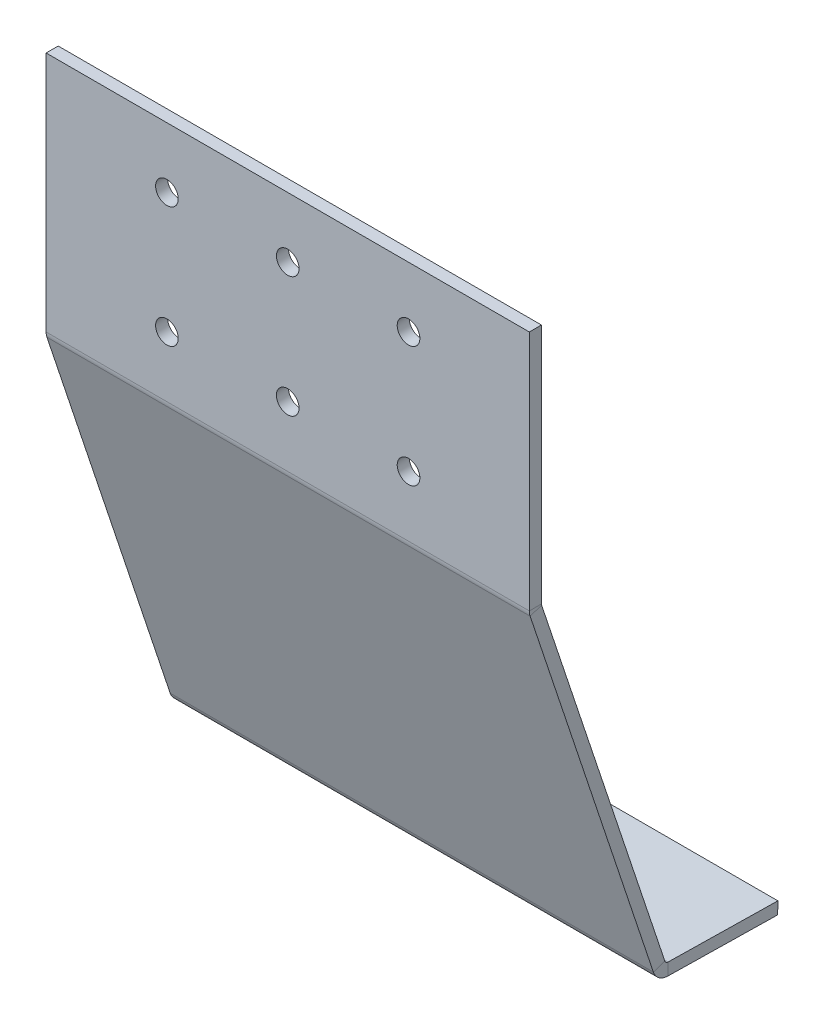
ISO-10303-21;
HEADER;
FILE_DESCRIPTION(('STEP AP214'),'2;1');
FILE_NAME('part.step','',(''),(''),'','','');
FILE_SCHEMA(('AUTOMOTIVE_DESIGN { 1 0 10303 214 1 1 1 1 }'));
ENDSEC;
DATA;
#1=APPLICATION_CONTEXT('core data for automotive mechanical design processes');
#2=APPLICATION_PROTOCOL_DEFINITION('international standard','automotive_design',2000,#1);
#3=PRODUCT_CONTEXT('',#1,'mechanical');
#4=PRODUCT('Part','Part','',(#3));
#5=PRODUCT_RELATED_PRODUCT_CATEGORY('part','',(#4));
#6=PRODUCT_DEFINITION_FORMATION('','',#4);
#7=PRODUCT_DEFINITION_CONTEXT('part definition',#1,'design');
#8=PRODUCT_DEFINITION('design','',#6,#7);
#9=PRODUCT_DEFINITION_SHAPE('','',#8);
#10=(LENGTH_UNIT() NAMED_UNIT(*) SI_UNIT(.MILLI.,.METRE.));
#11=(NAMED_UNIT(*) PLANE_ANGLE_UNIT() SI_UNIT($,.RADIAN.));
#12=(NAMED_UNIT(*) SI_UNIT($,.STERADIAN.) SOLID_ANGLE_UNIT());
#13=UNCERTAINTY_MEASURE_WITH_UNIT(LENGTH_MEASURE(1.E-05),#10,'distance_accuracy_value','');
#14=(GEOMETRIC_REPRESENTATION_CONTEXT(3) GLOBAL_UNCERTAINTY_ASSIGNED_CONTEXT((#13)) GLOBAL_UNIT_ASSIGNED_CONTEXT((#10,
#11,#12)) REPRESENTATION_CONTEXT('',''));
#15=CARTESIAN_POINT('',(0.,0.,0.));
#16=DIRECTION('',(0.,0.,1.));
#17=DIRECTION('',(1.,0.,0.));
#18=AXIS2_PLACEMENT_3D('',#15,#16,#17);
#19=CARTESIAN_POINT('',(-50.8,-107.259790632811,-27.101600760154));
#20=DIRECTION('',(1.,0.,0.));
#21=DIRECTION('',(0.,1.,0.));
#22=AXIS2_PLACEMENT_3D('',#19,#20,#21);
#23=PLANE('',#22);
#24=DIRECTION('',(0.,-0.316145823973795,0.948710608132918));
#25=VECTOR('',#24,1.);
#26=CARTESIAN_POINT('',(-50.8,-103.407012566149,-28.4950291588609));
#27=LINE('',#26,#25);
#28=CARTESIAN_POINT('',(-50.8,-103.407012566149,-28.4950291588609));
#29=VERTEX_POINT('',#28);
#30=CARTESIAN_POINT('',(-50.8,-104.210022959043,-26.0853042142033));
#31=VERTEX_POINT('',#30);
#32=EDGE_CURVE('E233',#29,#31,#27,.T.);
#33=ORIENTED_EDGE('',*,*,#32,.T.);
#34=DIRECTION('',(0.,-0.948710608132916,-0.3161458239738));
#35=VECTOR('',#34,1.);
#36=CARTESIAN_POINT('',(-50.8,-2.69937081364284,7.74183810876842));
#37=LINE('',#36,#35);
#38=CARTESIAN_POINT('',(-50.8,-26.4358834068326,-0.168054821391689));
#39=VERTEX_POINT('',#38);
#40=EDGE_CURVE('E225',#39,#31,#37,.T.);
#41=ORIENTED_EDGE('',*,*,#40,.F.);
#42=DIRECTION('',(0.,0.3161458239738,-0.948710608132916));
#43=VECTOR('',#42,1.);
#44=CARTESIAN_POINT('',(-50.8,-25.6328730139391,-2.5777797660493));
#45=LINE('',#44,#43);
#46=CARTESIAN_POINT('',(-50.8,-25.6328730139391,-2.57777976604932));
#47=VERTEX_POINT('',#46);
#48=EDGE_CURVE('E172',#47,#39,#45,.F.);
#49=ORIENTED_EDGE('',*,*,#48,.F.);
#50=DIRECTION('',(0.,0.948710608132916,0.3161458239738));
#51=VECTOR('',#50,1.);
#52=CARTESIAN_POINT('',(-50.8,-106.456780239918,-29.5113257048116));
#53=LINE('',#52,#51);
#54=EDGE_CURVE('E227',#47,#29,#53,.F.);
#55=ORIENTED_EDGE('',*,*,#54,.T.);
#56=EDGE_LOOP('',(#33,#41,#49,#55));
#57=FACE_BOUND('',#56,.T.);
#58=ADVANCED_FACE('F79',(#57),#23,.F.);
#59=CARTESIAN_POINT('',(50.8,-26.3225114686136,-0.13027505534239));
#60=DIRECTION('',(-1.,0.,0.));
#61=DIRECTION('',(0.,-1.,0.));
#62=AXIS2_PLACEMENT_3D('',#59,#60,#61);
#63=PLANE('',#62);
#64=DIRECTION('',(0.,-0.316145823973795,0.948710608132918));
#65=VECTOR('',#64,1.);
#66=CARTESIAN_POINT('',(50.8,-103.407012566149,-28.4950291588609));
#67=LINE('',#66,#65);
#68=CARTESIAN_POINT('',(50.8,-103.407012566149,-28.4950291588609));
#69=VERTEX_POINT('',#68);
#70=CARTESIAN_POINT('',(50.8,-104.210022959043,-26.0853042142033));
#71=VERTEX_POINT('',#70);
#72=EDGE_CURVE('E231',#69,#71,#67,.T.);
#73=ORIENTED_EDGE('',*,*,#72,.F.);
#74=DIRECTION('',(0.,-0.948710608132916,-0.3161458239738));
#75=VECTOR('',#74,1.);
#76=CARTESIAN_POINT('',(50.8,-25.5195010757201,-2.53999999999999));
#77=LINE('',#76,#75);
#78=CARTESIAN_POINT('',(50.8,-25.6328730139391,-2.57777976604929));
#79=VERTEX_POINT('',#78);
#80=EDGE_CURVE('E207',#69,#79,#77,.F.);
#81=ORIENTED_EDGE('',*,*,#80,.T.);
#82=DIRECTION('',(0.,0.3161458239738,-0.948710608132916));
#83=VECTOR('',#82,1.);
#84=CARTESIAN_POINT('',(50.8,-26.4358834068325,-0.168054821391686));
#85=LINE('',#84,#83);
#86=CARTESIAN_POINT('',(50.8,-26.4358834068325,-0.168054821391684));
#87=VERTEX_POINT('',#86);
#88=EDGE_CURVE('E197',#79,#87,#85,.F.);
#89=ORIENTED_EDGE('',*,*,#88,.T.);
#90=DIRECTION('',(0.,0.948710608132916,0.3161458239738));
#91=VECTOR('',#90,1.);
#92=CARTESIAN_POINT('',(50.8,-2.69937081364283,7.74183810876842));
#93=LINE('',#92,#91);
#94=EDGE_CURVE('E182',#71,#87,#93,.T.);
#95=ORIENTED_EDGE('',*,*,#94,.F.);
#96=EDGE_LOOP('',(#73,#81,#89,#95));
#97=FACE_BOUND('',#96,.T.);
#98=ADVANCED_FACE('F229',(#97),#63,.F.);
#99=CARTESIAN_POINT('',(0.,-2.69937081364283,7.74183810876842));
#100=DIRECTION('',(0.,0.3161458239738,-0.948710608132916));
#101=DIRECTION('',(0.,0.948710608132916,0.3161458239738));
#102=AXIS2_PLACEMENT_3D('',#99,#100,#101);
#103=PLANE('',#102);
#104=DIRECTION('',(-1.,0.,0.));
#105=VECTOR('',#104,1.);
#106=CARTESIAN_POINT('',(-50.8,-104.210022959043,-26.0853042142033));
#107=LINE('',#106,#105);
#108=EDGE_CURVE('E223',#31,#71,#107,.F.);
#109=ORIENTED_EDGE('',*,*,#108,.T.);
#110=ORIENTED_EDGE('',*,*,#94,.T.);
#111=DIRECTION('',(-1.,0.,0.));
#112=VECTOR('',#111,1.);
#113=CARTESIAN_POINT('',(50.8,-26.4358834068325,-0.168054821391683));
#114=LINE('',#113,#112);
#115=EDGE_CURVE('E220',#39,#87,#114,.F.);
#116=ORIENTED_EDGE('',*,*,#115,.F.);
#117=ORIENTED_EDGE('',*,*,#40,.T.);
#118=EDGE_LOOP('',(#109,#110,#116,#117));
#119=FACE_BOUND('',#118,.T.);
#120=ADVANCED_FACE('F218',(#119),#103,.F.);
#121=CARTESIAN_POINT('',(0.,-1.89636042074938,5.33211316411081));
#122=DIRECTION('',(0.,0.3161458239738,-0.948710608132916));
#123=DIRECTION('',(0.,0.948710608132916,0.3161458239738));
#124=AXIS2_PLACEMENT_3D('',#121,#122,#123);
#125=PLANE('',#124);
#126=ORIENTED_EDGE('',*,*,#80,.F.);
#127=DIRECTION('',(-1.,0.,0.));
#128=VECTOR('',#127,1.);
#129=CARTESIAN_POINT('',(-50.8,-103.407012566149,-28.4950291588609));
#130=LINE('',#129,#128);
#131=EDGE_CURVE('E96',#29,#69,#130,.F.);
#132=ORIENTED_EDGE('',*,*,#131,.F.);
#133=ORIENTED_EDGE('',*,*,#54,.F.);
#134=DIRECTION('',(-1.,0.,0.));
#135=VECTOR('',#134,1.);
#136=CARTESIAN_POINT('',(50.8,-25.6328730139391,-2.57777976604929));
#137=LINE('',#136,#135);
#138=EDGE_CURVE('E230',#79,#47,#137,.T.);
#139=ORIENTED_EDGE('',*,*,#138,.F.);
#140=EDGE_LOOP('',(#126,#132,#133,#139));
#141=FACE_BOUND('',#140,.T.);
#142=ADVANCED_FACE('F581',(#141),#125,.T.);
#143=CARTESIAN_POINT('',(-50.8,-25.4,-2.54));
#144=DIRECTION('',(-1.,0.,0.));
#145=DIRECTION('',(0.,0.,1.));
#146=AXIS2_PLACEMENT_3D('',#143,#144,#145);
#147=PLANE('',#146);
#148=DIRECTION('',(0.,-1.,0.));
#149=VECTOR('',#148,1.);
#150=CARTESIAN_POINT('',(-50.8,-25.4,0.));
#151=LINE('',#150,#149);
#152=CARTESIAN_POINT('',(-50.8,25.4,0.));
#153=VERTEX_POINT('',#152);
#154=CARTESIAN_POINT('',(-50.8,-25.4,0.));
#155=VERTEX_POINT('',#154);
#156=EDGE_CURVE('E126',#153,#155,#151,.T.);
#157=ORIENTED_EDGE('',*,*,#156,.F.);
#158=DIRECTION('',(0.,0.,1.));
#159=VECTOR('',#158,1.);
#160=CARTESIAN_POINT('',(-50.8,25.4,-2.54));
#161=LINE('',#160,#159);
#162=CARTESIAN_POINT('',(-50.8,25.4,-2.54));
#163=VERTEX_POINT('',#162);
#164=EDGE_CURVE('E13',#163,#153,#161,.T.);
#165=ORIENTED_EDGE('',*,*,#164,.F.);
#166=DIRECTION('',(0.,-1.,0.));
#167=VECTOR('',#166,1.);
#168=CARTESIAN_POINT('',(-50.8,-25.4,-2.54));
#169=LINE('',#168,#167);
#170=CARTESIAN_POINT('',(-50.8,-25.4,-2.54000000000003));
#171=VERTEX_POINT('',#170);
#172=EDGE_CURVE('E137',#163,#171,#169,.T.);
#173=ORIENTED_EDGE('',*,*,#172,.T.);
#174=DIRECTION('',(0.,0.,1.));
#175=VECTOR('',#174,1.);
#176=CARTESIAN_POINT('',(-50.8,-25.4,-2.54));
#177=LINE('',#176,#175);
#178=EDGE_CURVE('E83',#171,#155,#177,.T.);
#179=ORIENTED_EDGE('',*,*,#178,.T.);
#180=EDGE_LOOP('',(#157,#165,#173,#179));
#181=FACE_BOUND('',#180,.T.);
#182=ADVANCED_FACE('F81',(#181),#147,.T.);
#183=CARTESIAN_POINT('',(50.8,25.4,-2.54));
#184=DIRECTION('',(0.,1.,0.));
#185=DIRECTION('',(-1.,0.,0.));
#186=AXIS2_PLACEMENT_3D('',#183,#184,#185);
#187=PLANE('',#186);
#188=DIRECTION('',(-1.,0.,0.));
#189=VECTOR('',#188,1.);
#190=CARTESIAN_POINT('',(50.8,25.4,0.));
#191=LINE('',#190,#189);
#192=CARTESIAN_POINT('',(50.8,25.4,0.));
#193=VERTEX_POINT('',#192);
#194=EDGE_CURVE('E121',#193,#153,#191,.T.);
#195=ORIENTED_EDGE('',*,*,#194,.F.);
#196=DIRECTION('',(0.,0.,1.));
#197=VECTOR('',#196,1.);
#198=CARTESIAN_POINT('',(50.8,25.4,-2.54));
#199=LINE('',#198,#197);
#200=CARTESIAN_POINT('',(50.8,25.4,-2.54));
#201=VERTEX_POINT('',#200);
#202=EDGE_CURVE('E88',#201,#193,#199,.T.);
#203=ORIENTED_EDGE('',*,*,#202,.F.);
#204=DIRECTION('',(-1.,0.,0.));
#205=VECTOR('',#204,1.);
#206=CARTESIAN_POINT('',(50.8,25.4,-2.54));
#207=LINE('',#206,#205);
#208=EDGE_CURVE('E123',#201,#163,#207,.T.);
#209=ORIENTED_EDGE('',*,*,#208,.T.);
#210=ORIENTED_EDGE('',*,*,#164,.T.);
#211=EDGE_LOOP('',(#195,#203,#209,#210));
#212=FACE_BOUND('',#211,.T.);
#213=ADVANCED_FACE('F119',(#212),#187,.T.);
#214=CARTESIAN_POINT('',(50.8,-25.4,-2.54));
#215=DIRECTION('',(1.,0.,0.));
#216=DIRECTION('',(0.,0.,-1.));
#217=AXIS2_PLACEMENT_3D('',#214,#215,#216);
#218=PLANE('',#217);
#219=DIRECTION('',(0.,1.,0.));
#220=VECTOR('',#219,1.);
#221=CARTESIAN_POINT('',(50.8,-25.4,0.));
#222=LINE('',#221,#220);
#223=CARTESIAN_POINT('',(50.8,-25.4,0.));
#224=VERTEX_POINT('',#223);
#225=EDGE_CURVE('E136',#224,#193,#222,.T.);
#226=ORIENTED_EDGE('',*,*,#225,.F.);
#227=DIRECTION('',(0.,0.,1.));
#228=VECTOR('',#227,1.);
#229=CARTESIAN_POINT('',(50.8,-25.4,-2.54));
#230=LINE('',#229,#228);
#231=CARTESIAN_POINT('',(50.8,-25.4,-2.54));
#232=VERTEX_POINT('',#231);
#233=EDGE_CURVE('E144',#232,#224,#230,.T.);
#234=ORIENTED_EDGE('',*,*,#233,.F.);
#235=DIRECTION('',(0.,1.,0.));
#236=VECTOR('',#235,1.);
#237=CARTESIAN_POINT('',(50.8,-25.4,-2.54));
#238=LINE('',#237,#236);
#239=EDGE_CURVE('E150',#232,#201,#238,.T.);
#240=ORIENTED_EDGE('',*,*,#239,.T.);
#241=ORIENTED_EDGE('',*,*,#202,.T.);
#242=EDGE_LOOP('',(#226,#234,#240,#241));
#243=FACE_BOUND('',#242,.T.);
#244=ADVANCED_FACE('F199',(#243),#218,.T.);
#245=CARTESIAN_POINT('',(0.,0.,-2.54));
#246=DIRECTION('',(0.,0.,1.));
#247=DIRECTION('',(1.,0.,0.));
#248=AXIS2_PLACEMENT_3D('',#245,#246,#247);
#249=PLANE('',#248);
#250=CARTESIAN_POINT('',(-25.4,-12.7,-2.54));
#251=DIRECTION('',(0.,0.,1.));
#252=DIRECTION('',(1.,0.,0.));
#253=AXIS2_PLACEMENT_3D('',#250,#251,#252);
#254=CIRCLE('',#253,2.38125);
#255=CARTESIAN_POINT('',(-23.01875,-12.7,-2.54));
#256=VERTEX_POINT('',#255);
#257=EDGE_CURVE('E322',#256,#256,#254,.T.);
#258=ORIENTED_EDGE('',*,*,#257,.T.);
#259=EDGE_LOOP('',(#258));
#260=FACE_BOUND('',#259,.T.);
#261=CARTESIAN_POINT('',(0.,-12.7,-2.54));
#262=DIRECTION('',(0.,0.,1.));
#263=DIRECTION('',(1.,0.,0.));
#264=AXIS2_PLACEMENT_3D('',#261,#262,#263);
#265=CIRCLE('',#264,2.38125);
#266=CARTESIAN_POINT('',(2.38125,-12.7,-2.54));
#267=VERTEX_POINT('',#266);
#268=EDGE_CURVE('E316',#267,#267,#265,.T.);
#269=ORIENTED_EDGE('',*,*,#268,.T.);
#270=EDGE_LOOP('',(#269));
#271=FACE_BOUND('',#270,.T.);
#272=CARTESIAN_POINT('',(25.4,-12.7,-2.54));
#273=DIRECTION('',(0.,0.,1.));
#274=DIRECTION('',(1.,0.,0.));
#275=AXIS2_PLACEMENT_3D('',#272,#273,#274);
#276=CIRCLE('',#275,2.38125);
#277=CARTESIAN_POINT('',(27.78125,-12.7,-2.54));
#278=VERTEX_POINT('',#277);
#279=EDGE_CURVE('E310',#278,#278,#276,.T.);
#280=ORIENTED_EDGE('',*,*,#279,.T.);
#281=EDGE_LOOP('',(#280));
#282=FACE_BOUND('',#281,.T.);
#283=CARTESIAN_POINT('',(25.4,12.7,-2.54));
#284=DIRECTION('',(0.,0.,1.));
#285=DIRECTION('',(1.,0.,0.));
#286=AXIS2_PLACEMENT_3D('',#283,#284,#285);
#287=CIRCLE('',#286,2.38125);
#288=CARTESIAN_POINT('',(27.78125,12.7,-2.54));
#289=VERTEX_POINT('',#288);
#290=EDGE_CURVE('E304',#289,#289,#287,.T.);
#291=ORIENTED_EDGE('',*,*,#290,.T.);
#292=EDGE_LOOP('',(#291));
#293=FACE_BOUND('',#292,.T.);
#294=CARTESIAN_POINT('',(0.,12.7,-2.54));
#295=DIRECTION('',(0.,0.,1.));
#296=DIRECTION('',(1.,0.,0.));
#297=AXIS2_PLACEMENT_3D('',#294,#295,#296);
#298=CIRCLE('',#297,2.38125);
#299=CARTESIAN_POINT('',(2.38125,12.7,-2.54));
#300=VERTEX_POINT('',#299);
#301=EDGE_CURVE('E298',#300,#300,#298,.T.);
#302=ORIENTED_EDGE('',*,*,#301,.T.);
#303=EDGE_LOOP('',(#302));
#304=FACE_BOUND('',#303,.T.);
#305=CARTESIAN_POINT('',(-25.4,12.7,-2.54));
#306=DIRECTION('',(0.,0.,1.));
#307=DIRECTION('',(1.,0.,0.));
#308=AXIS2_PLACEMENT_3D('',#305,#306,#307);
#309=CIRCLE('',#308,2.38125);
#310=CARTESIAN_POINT('',(-23.01875,12.7,-2.54));
#311=VERTEX_POINT('',#310);
#312=EDGE_CURVE('E261',#311,#311,#309,.T.);
#313=ORIENTED_EDGE('',*,*,#312,.T.);
#314=EDGE_LOOP('',(#313));
#315=FACE_BOUND('',#314,.T.);
#316=ORIENTED_EDGE('',*,*,#172,.F.);
#317=ORIENTED_EDGE('',*,*,#208,.F.);
#318=ORIENTED_EDGE('',*,*,#239,.F.);
#319=DIRECTION('',(1.,0.,0.));
#320=VECTOR('',#319,1.);
#321=CARTESIAN_POINT('',(50.8,-25.4,-2.54));
#322=LINE('',#321,#320);
#323=EDGE_CURVE('E139',#171,#232,#322,.T.);
#324=ORIENTED_EDGE('',*,*,#323,.F.);
#325=EDGE_LOOP('',(#316,#317,#318,#324));
#326=FACE_BOUND('',#325,.T.);
#327=ADVANCED_FACE('F200',(#260,#271,#282,#293,#304,#315,#326),#249,.F.);
#328=CARTESIAN_POINT('',(0.,0.,0.));
#329=DIRECTION('',(0.,0.,1.));
#330=DIRECTION('',(1.,0.,0.));
#331=AXIS2_PLACEMENT_3D('',#328,#329,#330);
#332=PLANE('',#331);
#333=CARTESIAN_POINT('',(-25.4,-12.7,0.));
#334=DIRECTION('',(0.,0.,1.));
#335=DIRECTION('',(-1.,0.,0.));
#336=AXIS2_PLACEMENT_3D('',#333,#334,#335);
#337=CIRCLE('',#336,2.38125);
#338=CARTESIAN_POINT('',(-27.78125,-12.7,0.));
#339=VERTEX_POINT('',#338);
#340=EDGE_CURVE('E325',#339,#339,#337,.T.);
#341=ORIENTED_EDGE('',*,*,#340,.F.);
#342=EDGE_LOOP('',(#341));
#343=FACE_BOUND('',#342,.T.);
#344=CARTESIAN_POINT('',(0.,-12.7,0.));
#345=DIRECTION('',(0.,0.,1.));
#346=DIRECTION('',(-1.,0.,0.));
#347=AXIS2_PLACEMENT_3D('',#344,#345,#346);
#348=CIRCLE('',#347,2.38125);
#349=CARTESIAN_POINT('',(-2.38125,-12.7,0.));
#350=VERTEX_POINT('',#349);
#351=EDGE_CURVE('E319',#350,#350,#348,.T.);
#352=ORIENTED_EDGE('',*,*,#351,.F.);
#353=EDGE_LOOP('',(#352));
#354=FACE_BOUND('',#353,.T.);
#355=CARTESIAN_POINT('',(25.4,-12.7,0.));
#356=DIRECTION('',(0.,0.,1.));
#357=DIRECTION('',(-1.,0.,0.));
#358=AXIS2_PLACEMENT_3D('',#355,#356,#357);
#359=CIRCLE('',#358,2.38125);
#360=CARTESIAN_POINT('',(23.01875,-12.7,0.));
#361=VERTEX_POINT('',#360);
#362=EDGE_CURVE('E313',#361,#361,#359,.T.);
#363=ORIENTED_EDGE('',*,*,#362,.F.);
#364=EDGE_LOOP('',(#363));
#365=FACE_BOUND('',#364,.T.);
#366=CARTESIAN_POINT('',(25.4,12.7,0.));
#367=DIRECTION('',(0.,0.,1.));
#368=DIRECTION('',(1.,0.,0.));
#369=AXIS2_PLACEMENT_3D('',#366,#367,#368);
#370=CIRCLE('',#369,2.38125);
#371=CARTESIAN_POINT('',(27.78125,12.7,0.));
#372=VERTEX_POINT('',#371);
#373=EDGE_CURVE('E307',#372,#372,#370,.T.);
#374=ORIENTED_EDGE('',*,*,#373,.F.);
#375=EDGE_LOOP('',(#374));
#376=FACE_BOUND('',#375,.T.);
#377=CARTESIAN_POINT('',(0.,12.7,0.));
#378=DIRECTION('',(0.,0.,1.));
#379=DIRECTION('',(1.,0.,0.));
#380=AXIS2_PLACEMENT_3D('',#377,#378,#379);
#381=CIRCLE('',#380,2.38125);
#382=CARTESIAN_POINT('',(2.38125,12.7,0.));
#383=VERTEX_POINT('',#382);
#384=EDGE_CURVE('E301',#383,#383,#381,.T.);
#385=ORIENTED_EDGE('',*,*,#384,.F.);
#386=EDGE_LOOP('',(#385));
#387=FACE_BOUND('',#386,.T.);
#388=CARTESIAN_POINT('',(-25.4,12.7,0.));
#389=DIRECTION('',(0.,0.,1.));
#390=DIRECTION('',(1.,0.,0.));
#391=AXIS2_PLACEMENT_3D('',#388,#389,#390);
#392=CIRCLE('',#391,2.38125);
#393=CARTESIAN_POINT('',(-23.01875,12.7,0.));
#394=VERTEX_POINT('',#393);
#395=EDGE_CURVE('E295',#394,#394,#392,.T.);
#396=ORIENTED_EDGE('',*,*,#395,.F.);
#397=EDGE_LOOP('',(#396));
#398=FACE_BOUND('',#397,.T.);
#399=ORIENTED_EDGE('',*,*,#156,.T.);
#400=DIRECTION('',(1.,0.,0.));
#401=VECTOR('',#400,1.);
#402=CARTESIAN_POINT('',(50.8,-25.4,0.));
#403=LINE('',#402,#401);
#404=EDGE_CURVE('E130',#155,#224,#403,.T.);
#405=ORIENTED_EDGE('',*,*,#404,.T.);
#406=ORIENTED_EDGE('',*,*,#225,.T.);
#407=ORIENTED_EDGE('',*,*,#194,.T.);
#408=EDGE_LOOP('',(#399,#405,#406,#407));
#409=FACE_BOUND('',#408,.T.);
#410=ADVANCED_FACE('F134',(#343,#354,#365,#376,#387,#398,#409),#332,.T.);
#411=CARTESIAN_POINT('',(50.8,-25.4,-3.2766));
#412=DIRECTION('',(1.,0.,0.));
#413=DIRECTION('',(0.,0.,-1.));
#414=AXIS2_PLACEMENT_3D('',#411,#412,#413);
#415=PLANE('',#414);
#416=ORIENTED_EDGE('',*,*,#88,.F.);
#417=CARTESIAN_POINT('',(50.8,-25.4,-3.2766));
#418=DIRECTION('',(-1.,0.,0.));
#419=DIRECTION('',(0.,0.,1.));
#420=AXIS2_PLACEMENT_3D('',#417,#418,#419);
#421=CIRCLE('',#420,0.736600000000006);
#422=EDGE_CURVE('E174',#232,#79,#421,.F.);
#423=ORIENTED_EDGE('',*,*,#422,.F.);
#424=ORIENTED_EDGE('',*,*,#233,.T.);
#425=CARTESIAN_POINT('',(50.8,-25.4,-3.2766));
#426=DIRECTION('',(-1.,0.,0.));
#427=DIRECTION('',(0.,0.,1.));
#428=AXIS2_PLACEMENT_3D('',#425,#426,#427);
#429=CIRCLE('',#428,3.27660000000001);
#430=EDGE_CURVE('E131',#224,#87,#429,.F.);
#431=ORIENTED_EDGE('',*,*,#430,.T.);
#432=EDGE_LOOP('',(#416,#423,#424,#431));
#433=FACE_BOUND('',#432,.T.);
#434=ADVANCED_FACE('F195',(#433),#415,.T.);
#435=CARTESIAN_POINT('',(-50.8,-25.4,-3.27660000000003));
#436=DIRECTION('',(1.,0.,0.));
#437=DIRECTION('',(0.,0.,-1.));
#438=AXIS2_PLACEMENT_3D('',#435,#436,#437);
#439=PLANE('',#438);
#440=CARTESIAN_POINT('',(-50.8,-25.4,-3.27660000000003));
#441=DIRECTION('',(-1.,0.,0.));
#442=DIRECTION('',(0.,0.,1.));
#443=AXIS2_PLACEMENT_3D('',#440,#441,#442);
#444=CIRCLE('',#443,0.736600000000006);
#445=EDGE_CURVE('E178',#47,#171,#444,.T.);
#446=ORIENTED_EDGE('',*,*,#445,.F.);
#447=ORIENTED_EDGE('',*,*,#48,.T.);
#448=CARTESIAN_POINT('',(-50.8,-25.4,-3.27660000000003));
#449=DIRECTION('',(-1.,0.,0.));
#450=DIRECTION('',(0.,0.,1.));
#451=AXIS2_PLACEMENT_3D('',#448,#449,#450);
#452=CIRCLE('',#451,3.27660000000001);
#453=EDGE_CURVE('E162',#39,#155,#452,.T.);
#454=ORIENTED_EDGE('',*,*,#453,.T.);
#455=ORIENTED_EDGE('',*,*,#178,.F.);
#456=EDGE_LOOP('',(#446,#447,#454,#455));
#457=FACE_BOUND('',#456,.T.);
#458=ADVANCED_FACE('F168',(#457),#439,.F.);
#459=CARTESIAN_POINT('',(-50.8,-25.4,-3.27660000000003));
#460=DIRECTION('',(-1.,0.,0.));
#461=DIRECTION('',(0.,-0.3161458239738,0.948710608132916));
#462=AXIS2_PLACEMENT_3D('',#459,#460,#461);
#463=CYLINDRICAL_SURFACE('',#462,3.27660000000001);
#464=ORIENTED_EDGE('',*,*,#404,.F.);
#465=ORIENTED_EDGE('',*,*,#453,.F.);
#466=ORIENTED_EDGE('',*,*,#115,.T.);
#467=ORIENTED_EDGE('',*,*,#430,.F.);
#468=EDGE_LOOP('',(#464,#465,#466,#467));
#469=FACE_BOUND('',#468,.T.);
#470=ADVANCED_FACE('F159',(#469),#463,.T.);
#471=CARTESIAN_POINT('',(-50.8,-25.4,-3.27660000000003));
#472=DIRECTION('',(-1.,0.,0.));
#473=DIRECTION('',(0.,-0.3161458239738,0.948710608132916));
#474=AXIS2_PLACEMENT_3D('',#471,#472,#473);
#475=CYLINDRICAL_SURFACE('',#474,0.736600000000006);
#476=ORIENTED_EDGE('',*,*,#323,.T.);
#477=ORIENTED_EDGE('',*,*,#422,.T.);
#478=ORIENTED_EDGE('',*,*,#138,.T.);
#479=ORIENTED_EDGE('',*,*,#445,.T.);
#480=EDGE_LOOP('',(#476,#477,#478,#479));
#481=FACE_BOUND('',#480,.T.);
#482=ADVANCED_FACE('F187',(#481),#475,.F.);
#483=CARTESIAN_POINT('',(50.8,-103.17413955221,-29.1938493928116));
#484=DIRECTION('',(1.,0.,0.));
#485=DIRECTION('',(0.,0.,-1.));
#486=AXIS2_PLACEMENT_3D('',#483,#484,#485);
#487=PLANE('',#486);
#488=DIRECTION('',(0.,-0.999847695156391,0.017452406437294));
#489=VECTOR('',#488,1.);
#490=CARTESIAN_POINT('',(50.8,-106.450240510159,-29.1366648378792));
#491=LINE('',#490,#489);
#492=CARTESIAN_POINT('',(50.8,-103.910627364462,-29.1809939502299));
#493=VERTEX_POINT('',#492);
#494=CARTESIAN_POINT('',(50.8,-106.450240510159,-29.1366648378792));
#495=VERTEX_POINT('',#494);
#496=EDGE_CURVE('E257',#493,#495,#491,.T.);
#497=ORIENTED_EDGE('',*,*,#496,.F.);
#498=CARTESIAN_POINT('',(50.8,-103.17413955221,-29.1938493928116));
#499=DIRECTION('',(-1.,0.,0.));
#500=DIRECTION('',(0.,0.,1.));
#501=AXIS2_PLACEMENT_3D('',#498,#499,#500);
#502=CIRCLE('',#501,0.736599999999992);
#503=EDGE_CURVE('E248',#69,#493,#502,.F.);
#504=ORIENTED_EDGE('',*,*,#503,.F.);
#505=ORIENTED_EDGE('',*,*,#72,.T.);
#506=CARTESIAN_POINT('',(50.8,-103.17413955221,-29.1938493928116));
#507=DIRECTION('',(-1.,0.,0.));
#508=DIRECTION('',(0.,0.,1.));
#509=AXIS2_PLACEMENT_3D('',#506,#507,#508);
#510=CIRCLE('',#509,3.27659999999999);
#511=EDGE_CURVE('E241',#71,#495,#510,.F.);
#512=ORIENTED_EDGE('',*,*,#511,.T.);
#513=EDGE_LOOP('',(#497,#504,#505,#512));
#514=FACE_BOUND('',#513,.T.);
#515=ADVANCED_FACE('F375',(#514),#487,.T.);
#516=CARTESIAN_POINT('',(-50.8,-103.17413955221,-29.1938493928116));
#517=DIRECTION('',(1.,0.,0.));
#518=DIRECTION('',(0.,0.,-1.));
#519=AXIS2_PLACEMENT_3D('',#516,#517,#518);
#520=PLANE('',#519);
#521=CARTESIAN_POINT('',(-50.8,-103.17413955221,-29.1938493928116));
#522=DIRECTION('',(-1.,0.,0.));
#523=DIRECTION('',(0.,0.,1.));
#524=AXIS2_PLACEMENT_3D('',#521,#522,#523);
#525=CIRCLE('',#524,0.736599999999992);
#526=CARTESIAN_POINT('',(-50.8,-103.910627364462,-29.1809939502299));
#527=VERTEX_POINT('',#526);
#528=EDGE_CURVE('E243',#527,#29,#525,.T.);
#529=ORIENTED_EDGE('',*,*,#528,.F.);
#530=DIRECTION('',(0.,-0.999847695156391,0.017452406437294));
#531=VECTOR('',#530,1.);
#532=CARTESIAN_POINT('',(-50.8,-103.910627364462,-29.1809939502299));
#533=LINE('',#532,#531);
#534=CARTESIAN_POINT('',(-50.8,-106.450240510159,-29.1366648378792));
#535=VERTEX_POINT('',#534);
#536=EDGE_CURVE('E264',#527,#535,#533,.T.);
#537=ORIENTED_EDGE('',*,*,#536,.T.);
#538=CARTESIAN_POINT('',(-50.8,-103.17413955221,-29.1938493928116));
#539=DIRECTION('',(-1.,0.,0.));
#540=DIRECTION('',(0.,0.,1.));
#541=AXIS2_PLACEMENT_3D('',#538,#539,#540);
#542=CIRCLE('',#541,3.27659999999999);
#543=EDGE_CURVE('E251',#535,#31,#542,.T.);
#544=ORIENTED_EDGE('',*,*,#543,.T.);
#545=ORIENTED_EDGE('',*,*,#32,.F.);
#546=EDGE_LOOP('',(#529,#537,#544,#545));
#547=FACE_BOUND('',#546,.T.);
#548=ADVANCED_FACE('F397',(#547),#520,.F.);
#549=CARTESIAN_POINT('',(-50.8,-103.17413955221,-29.1938493928116));
#550=DIRECTION('',(-1.,0.,0.));
#551=DIRECTION('',(0.,-0.999847695156391,0.0174524064372941));
#552=AXIS2_PLACEMENT_3D('',#549,#550,#551);
#553=CYLINDRICAL_SURFACE('',#552,3.27659999999999);
#554=ORIENTED_EDGE('',*,*,#108,.F.);
#555=ORIENTED_EDGE('',*,*,#543,.F.);
#556=DIRECTION('',(-1.,0.,0.));
#557=VECTOR('',#556,1.);
#558=CARTESIAN_POINT('',(0.,-106.450240510159,-29.1366648378792));
#559=LINE('',#558,#557);
#560=EDGE_CURVE('E267',#495,#535,#559,.T.);
#561=ORIENTED_EDGE('',*,*,#560,.F.);
#562=ORIENTED_EDGE('',*,*,#511,.F.);
#563=EDGE_LOOP('',(#554,#555,#561,#562));
#564=FACE_BOUND('',#563,.T.);
#565=ADVANCED_FACE('F406',(#564),#553,.T.);
#566=CARTESIAN_POINT('',(-50.8,-103.17413955221,-29.1938493928116));
#567=DIRECTION('',(-1.,0.,0.));
#568=DIRECTION('',(0.,-0.999847695156391,0.0174524064372941));
#569=AXIS2_PLACEMENT_3D('',#566,#567,#568);
#570=CYLINDRICAL_SURFACE('',#569,0.736599999999992);
#571=ORIENTED_EDGE('',*,*,#131,.T.);
#572=ORIENTED_EDGE('',*,*,#503,.T.);
#573=DIRECTION('',(1.,0.,0.));
#574=VECTOR('',#573,1.);
#575=CARTESIAN_POINT('',(50.8,-103.910627364462,-29.1809939502299));
#576=LINE('',#575,#574);
#577=EDGE_CURVE('E260',#493,#527,#576,.F.);
#578=ORIENTED_EDGE('',*,*,#577,.T.);
#579=ORIENTED_EDGE('',*,*,#528,.T.);
#580=EDGE_LOOP('',(#571,#572,#578,#579));
#581=FACE_BOUND('',#580,.T.);
#582=ADVANCED_FACE('F414',(#581),#570,.F.);
#583=CARTESIAN_POINT('',(-50.8,-106.441143401271,-28.6154918186822));
#584=DIRECTION('',(-1.,0.,0.));
#585=DIRECTION('',(0.,0.,1.));
#586=AXIS2_PLACEMENT_3D('',#583,#584,#585);
#587=PLANE('',#586);
#588=DIRECTION('',(0.,0.0174524064372941,0.999847695156391));
#589=VECTOR('',#588,1.);
#590=CARTESIAN_POINT('',(-50.8,-106.441143401271,-28.6154918186822));
#591=LINE('',#590,#589);
#592=CARTESIAN_POINT('',(-50.7999999999999,-106.853065183782,-52.214474933596));
#593=VERTEX_POINT('',#592);
#594=EDGE_CURVE('E285',#593,#535,#591,.T.);
#595=ORIENTED_EDGE('',*,*,#594,.T.);
#596=ORIENTED_EDGE('',*,*,#536,.F.);
#597=DIRECTION('',(0.,-0.0174524064372941,-0.999847695156391));
#598=VECTOR('',#597,1.);
#599=CARTESIAN_POINT('',(-50.8,-103.354139751434,2.70016004812564));
#600=LINE('',#599,#598);
#601=CARTESIAN_POINT('',(-50.7999999999999,-104.313452038084,-52.2588040459468));
#602=VERTEX_POINT('',#601);
#603=EDGE_CURVE('E276',#602,#527,#600,.F.);
#604=ORIENTED_EDGE('',*,*,#603,.F.);
#605=DIRECTION('',(0.,0.999847695156391,-0.017452406437294));
#606=VECTOR('',#605,1.);
#607=CARTESIAN_POINT('',(-50.7999999999999,-106.853065183782,-52.214474933596));
#608=LINE('',#607,#606);
#609=EDGE_CURVE('E246',#593,#602,#608,.T.);
#610=ORIENTED_EDGE('',*,*,#609,.F.);
#611=EDGE_LOOP('',(#595,#596,#604,#610));
#612=FACE_BOUND('',#611,.T.);
#613=ADVANCED_FACE('F422',(#612),#587,.T.);
#614=CARTESIAN_POINT('',(50.8,-106.853065183782,-52.214474933596));
#615=DIRECTION('',(1.,0.,0.));
#616=DIRECTION('',(0.,0.,-1.));
#617=AXIS2_PLACEMENT_3D('',#614,#615,#616);
#618=PLANE('',#617);
#619=DIRECTION('',(0.,0.0174524064372941,0.999847695156391));
#620=VECTOR('',#619,1.);
#621=CARTESIAN_POINT('',(50.8,-103.354139751434,2.70016004812579));
#622=LINE('',#621,#620);
#623=CARTESIAN_POINT('',(50.8,-104.313452038084,-52.2588040459468));
#624=VERTEX_POINT('',#623);
#625=EDGE_CURVE('E270',#493,#624,#622,.F.);
#626=ORIENTED_EDGE('',*,*,#625,.F.);
#627=ORIENTED_EDGE('',*,*,#496,.T.);
#628=DIRECTION('',(0.,-0.0174524064372941,-0.999847695156391));
#629=VECTOR('',#628,1.);
#630=CARTESIAN_POINT('',(50.8,-106.853065183782,-52.214474933596));
#631=LINE('',#630,#629);
#632=CARTESIAN_POINT('',(50.8,-106.853065183782,-52.214474933596));
#633=VERTEX_POINT('',#632);
#634=EDGE_CURVE('E279',#495,#633,#631,.T.);
#635=ORIENTED_EDGE('',*,*,#634,.T.);
#636=DIRECTION('',(0.,0.999847695156391,-0.017452406437294));
#637=VECTOR('',#636,1.);
#638=CARTESIAN_POINT('',(50.8,-106.853065183782,-52.214474933596));
#639=LINE('',#638,#637);
#640=EDGE_CURVE('E288',#633,#624,#639,.T.);
#641=ORIENTED_EDGE('',*,*,#640,.T.);
#642=EDGE_LOOP('',(#626,#627,#635,#641));
#643=FACE_BOUND('',#642,.T.);
#644=ADVANCED_FACE('F430',(#643),#618,.T.);
#645=CARTESIAN_POINT('',(0.,-105.893752897131,2.74448916047644));
#646=DIRECTION('',(0.,-0.999847695156391,0.0174524064372941));
#647=DIRECTION('',(0.,-0.0174524064372941,-0.999847695156391));
#648=AXIS2_PLACEMENT_3D('',#645,#646,#647);
#649=PLANE('',#648);
#650=ORIENTED_EDGE('',*,*,#634,.F.);
#651=ORIENTED_EDGE('',*,*,#560,.T.);
#652=ORIENTED_EDGE('',*,*,#594,.F.);
#653=DIRECTION('',(-1.,0.,0.));
#654=VECTOR('',#653,1.);
#655=CARTESIAN_POINT('',(-50.7999999999999,-106.853065183782,-52.214474933596));
#656=LINE('',#655,#654);
#657=EDGE_CURVE('E282',#633,#593,#656,.T.);
#658=ORIENTED_EDGE('',*,*,#657,.F.);
#659=EDGE_LOOP('',(#650,#651,#652,#658));
#660=FACE_BOUND('',#659,.T.);
#661=ADVANCED_FACE('F438',(#660),#649,.T.);
#662=CARTESIAN_POINT('',(0.,-103.354139751434,2.70016004812571));
#663=DIRECTION('',(0.,-0.999847695156391,0.0174524064372941));
#664=DIRECTION('',(0.,-0.0174524064372941,-0.999847695156391));
#665=AXIS2_PLACEMENT_3D('',#662,#663,#664);
#666=PLANE('',#665);
#667=ORIENTED_EDGE('',*,*,#577,.F.);
#668=ORIENTED_EDGE('',*,*,#625,.T.);
#669=DIRECTION('',(1.,0.,0.));
#670=VECTOR('',#669,1.);
#671=CARTESIAN_POINT('',(0.,-104.313452038084,-52.2588040459468));
#672=LINE('',#671,#670);
#673=EDGE_CURVE('E273',#624,#602,#672,.F.);
#674=ORIENTED_EDGE('',*,*,#673,.T.);
#675=ORIENTED_EDGE('',*,*,#603,.T.);
#676=EDGE_LOOP('',(#667,#668,#674,#675));
#677=FACE_BOUND('',#676,.T.);
#678=ADVANCED_FACE('F446',(#677),#666,.F.);
#679=CARTESIAN_POINT('',(-50.7999999999999,-106.853065183782,-52.214474933596));
#680=DIRECTION('',(0.,-0.017452406437294,-0.999847695156391));
#681=DIRECTION('',(0.,0.999847695156391,-0.017452406437294));
#682=AXIS2_PLACEMENT_3D('',#679,#680,#681);
#683=PLANE('',#682);
#684=ORIENTED_EDGE('',*,*,#673,.F.);
#685=ORIENTED_EDGE('',*,*,#640,.F.);
#686=ORIENTED_EDGE('',*,*,#657,.T.);
#687=ORIENTED_EDGE('',*,*,#609,.T.);
#688=EDGE_LOOP('',(#684,#685,#686,#687));
#689=FACE_BOUND('',#688,.T.);
#690=ADVANCED_FACE('F349',(#689),#683,.T.);
#691=CARTESIAN_POINT('',(-25.4,12.7,-52.2588040459468));
#692=DIRECTION('',(0.,0.,1.));
#693=DIRECTION('',(1.,0.,0.));
#694=AXIS2_PLACEMENT_3D('',#691,#692,#693);
#695=CYLINDRICAL_SURFACE('',#694,2.38125);
#696=ORIENTED_EDGE('',*,*,#395,.T.);
#697=EDGE_LOOP('',(#696));
#698=FACE_BOUND('',#697,.T.);
#699=ORIENTED_EDGE('',*,*,#312,.F.);
#700=EDGE_LOOP('',(#699));
#701=FACE_BOUND('',#700,.T.);
#702=ADVANCED_FACE('F345',(#698,#701),#695,.F.);
#703=CARTESIAN_POINT('',(0.,12.7,-52.2588040459468));
#704=DIRECTION('',(0.,0.,1.));
#705=DIRECTION('',(1.,0.,0.));
#706=AXIS2_PLACEMENT_3D('',#703,#704,#705);
#707=CYLINDRICAL_SURFACE('',#706,2.38125);
#708=ORIENTED_EDGE('',*,*,#384,.T.);
#709=EDGE_LOOP('',(#708));
#710=FACE_BOUND('',#709,.T.);
#711=ORIENTED_EDGE('',*,*,#301,.F.);
#712=EDGE_LOOP('',(#711));
#713=FACE_BOUND('',#712,.T.);
#714=ADVANCED_FACE('F348',(#710,#713),#707,.F.);
#715=CARTESIAN_POINT('',(25.4,12.7,-52.2588040459468));
#716=DIRECTION('',(0.,0.,1.));
#717=DIRECTION('',(1.,0.,0.));
#718=AXIS2_PLACEMENT_3D('',#715,#716,#717);
#719=CYLINDRICAL_SURFACE('',#718,2.38125);
#720=ORIENTED_EDGE('',*,*,#373,.T.);
#721=EDGE_LOOP('',(#720));
#722=FACE_BOUND('',#721,.T.);
#723=ORIENTED_EDGE('',*,*,#290,.F.);
#724=EDGE_LOOP('',(#723));
#725=FACE_BOUND('',#724,.T.);
#726=ADVANCED_FACE('F471',(#722,#725),#719,.F.);
#727=CARTESIAN_POINT('',(25.4,-12.7,-52.2588040459468));
#728=DIRECTION('',(0.,0.,1.));
#729=DIRECTION('',(1.,0.,0.));
#730=AXIS2_PLACEMENT_3D('',#727,#728,#729);
#731=CYLINDRICAL_SURFACE('',#730,2.38125);
#732=ORIENTED_EDGE('',*,*,#362,.T.);
#733=EDGE_LOOP('',(#732));
#734=FACE_BOUND('',#733,.T.);
#735=ORIENTED_EDGE('',*,*,#279,.F.);
#736=EDGE_LOOP('',(#735));
#737=FACE_BOUND('',#736,.T.);
#738=ADVANCED_FACE('F479',(#734,#737),#731,.F.);
#739=CARTESIAN_POINT('',(0.,-12.7,-52.2588040459468));
#740=DIRECTION('',(0.,0.,1.));
#741=DIRECTION('',(1.,0.,0.));
#742=AXIS2_PLACEMENT_3D('',#739,#740,#741);
#743=CYLINDRICAL_SURFACE('',#742,2.38125);
#744=ORIENTED_EDGE('',*,*,#351,.T.);
#745=EDGE_LOOP('',(#744));
#746=FACE_BOUND('',#745,.T.);
#747=ORIENTED_EDGE('',*,*,#268,.F.);
#748=EDGE_LOOP('',(#747));
#749=FACE_BOUND('',#748,.T.);
#750=ADVANCED_FACE('F487',(#746,#749),#743,.F.);
#751=CARTESIAN_POINT('',(-25.4,-12.7,-52.2588040459468));
#752=DIRECTION('',(0.,0.,1.));
#753=DIRECTION('',(1.,0.,0.));
#754=AXIS2_PLACEMENT_3D('',#751,#752,#753);
#755=CYLINDRICAL_SURFACE('',#754,2.38125);
#756=ORIENTED_EDGE('',*,*,#340,.T.);
#757=EDGE_LOOP('',(#756));
#758=FACE_BOUND('',#757,.T.);
#759=ORIENTED_EDGE('',*,*,#257,.F.);
#760=EDGE_LOOP('',(#759));
#761=FACE_BOUND('',#760,.T.);
#762=ADVANCED_FACE('F329',(#758,#761),#755,.F.);
#763=CLOSED_SHELL('',(#58,#98,#120,#142,#182,#213,#244,#327,#410,#434,#458,#470,#482,#515,#548,
#565,#582,#613,#644,#661,#678,#690,#702,#714,#726,#738,#750,#762));
#764=MANIFOLD_SOLID_BREP('B2',#763);
#765=ADVANCED_BREP_SHAPE_REPRESENTATION('',(#18,#764),#14);
#766=SHAPE_DEFINITION_REPRESENTATION(#9,#765);
ENDSEC;
END-ISO-10303-21;
